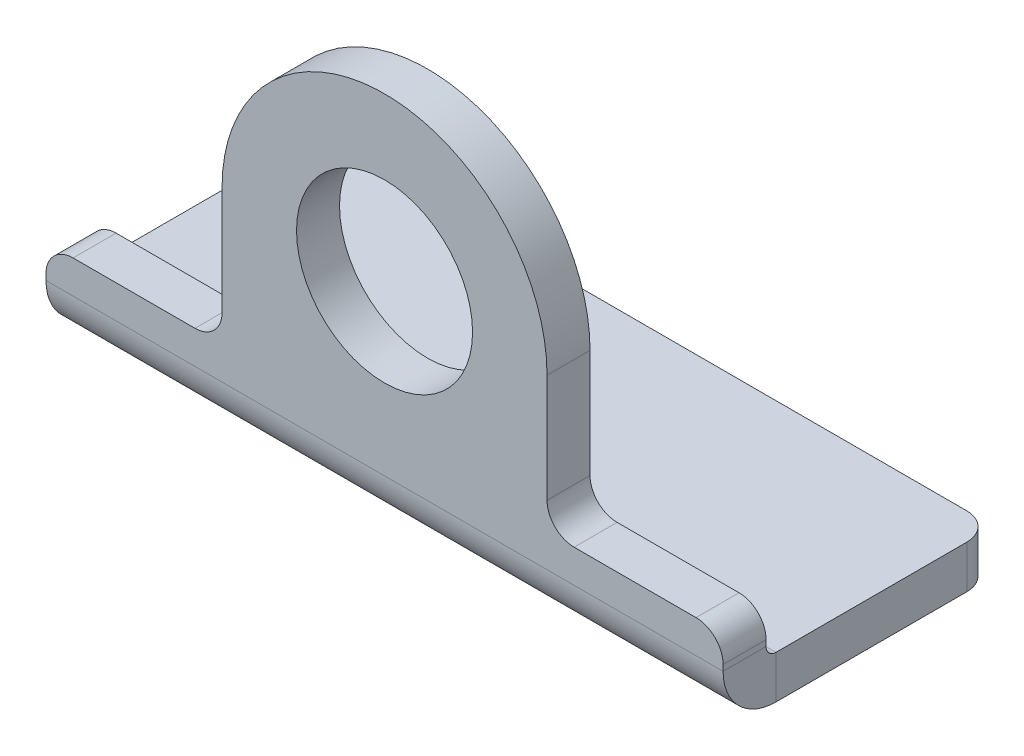
ISO-10303-21;
HEADER;
FILE_DESCRIPTION(('STEP AP214'),'2;1');
FILE_NAME('part.step','',(''),(''),'','','');
FILE_SCHEMA(('AUTOMOTIVE_DESIGN { 1 0 10303 214 1 1 1 1 }'));
ENDSEC;
DATA;
#1=APPLICATION_CONTEXT('core data for automotive mechanical design processes');
#2=APPLICATION_PROTOCOL_DEFINITION('international standard','automotive_design',2000,#1);
#3=PRODUCT_CONTEXT('',#1,'mechanical');
#4=PRODUCT('Part','Part','',(#3));
#5=PRODUCT_RELATED_PRODUCT_CATEGORY('part','',(#4));
#6=PRODUCT_DEFINITION_FORMATION('','',#4);
#7=PRODUCT_DEFINITION_CONTEXT('part definition',#1,'design');
#8=PRODUCT_DEFINITION('design','',#6,#7);
#9=PRODUCT_DEFINITION_SHAPE('','',#8);
#10=(LENGTH_UNIT() NAMED_UNIT(*) SI_UNIT(.MILLI.,.METRE.));
#11=(NAMED_UNIT(*) PLANE_ANGLE_UNIT() SI_UNIT($,.RADIAN.));
#12=(NAMED_UNIT(*) SI_UNIT($,.STERADIAN.) SOLID_ANGLE_UNIT());
#13=UNCERTAINTY_MEASURE_WITH_UNIT(LENGTH_MEASURE(1.E-05),#10,'distance_accuracy_value','');
#14=(GEOMETRIC_REPRESENTATION_CONTEXT(3) GLOBAL_UNCERTAINTY_ASSIGNED_CONTEXT((#13)) GLOBAL_UNIT_ASSIGNED_CONTEXT((#10,
#11,#12)) REPRESENTATION_CONTEXT('',''));
#15=CARTESIAN_POINT('',(0.,0.,0.));
#16=DIRECTION('',(0.,0.,1.));
#17=DIRECTION('',(1.,0.,0.));
#18=AXIS2_PLACEMENT_3D('',#15,#16,#17);
#19=CARTESIAN_POINT('',(-25.,1.17499999999999,-3.175));
#20=DIRECTION('',(-1.,0.,0.));
#21=DIRECTION('',(0.,0.,1.));
#22=AXIS2_PLACEMENT_3D('',#19,#20,#21);
#23=PLANE('',#22);
#24=DIRECTION('',(0.,-1.,0.));
#25=VECTOR('',#24,1.);
#26=CARTESIAN_POINT('',(-25.,1.17499999999999,-3.175));
#27=LINE('',#26,#25);
#28=CARTESIAN_POINT('',(-25.,1.17499999999999,-3.175));
#29=VERTEX_POINT('',#28);
#30=CARTESIAN_POINT('',(-25.,0.736599999999997,-3.175));
#31=VERTEX_POINT('',#30);
#32=EDGE_CURVE('E335',#29,#31,#27,.T.);
#33=ORIENTED_EDGE('',*,*,#32,.T.);
#34=DIRECTION('',(0.,0.,1.));
#35=VECTOR('',#34,1.);
#36=CARTESIAN_POINT('',(-25.,0.736599999999997,-3.175));
#37=LINE('',#36,#35);
#38=CARTESIAN_POINT('',(-25.,0.736599999999993,0.));
#39=VERTEX_POINT('',#38);
#40=EDGE_CURVE('E270',#31,#39,#37,.T.);
#41=ORIENTED_EDGE('',*,*,#40,.T.);
#42=DIRECTION('',(0.,-1.,0.));
#43=VECTOR('',#42,1.);
#44=CARTESIAN_POINT('',(-25.,1.17499999999999,0.));
#45=LINE('',#44,#43);
#46=CARTESIAN_POINT('',(-25.,1.17499999999999,0.));
#47=VERTEX_POINT('',#46);
#48=EDGE_CURVE('E299',#47,#39,#45,.T.);
#49=ORIENTED_EDGE('',*,*,#48,.F.);
#50=DIRECTION('',(0.,0.,1.));
#51=VECTOR('',#50,1.);
#52=CARTESIAN_POINT('',(-25.,1.17499999999999,-3.175));
#53=LINE('',#52,#51);
#54=EDGE_CURVE('E381',#29,#47,#53,.T.);
#55=ORIENTED_EDGE('',*,*,#54,.F.);
#56=EDGE_LOOP('',(#33,#41,#49,#55));
#57=FACE_BOUND('',#56,.T.);
#58=ADVANCED_FACE('F51',(#57),#23,.T.);
#59=CARTESIAN_POINT('',(23.,1.17500000000001,-3.175));
#60=DIRECTION('',(0.,0.,1.));
#61=DIRECTION('',(1.,0.,0.));
#62=AXIS2_PLACEMENT_3D('',#59,#60,#61);
#63=PLANE('',#62);
#64=CARTESIAN_POINT('',(0.,13.175,-3.175));
#65=DIRECTION('',(0.,0.,1.));
#66=DIRECTION('',(1.,0.,0.));
#67=AXIS2_PLACEMENT_3D('',#64,#65,#66);
#68=CIRCLE('',#67,6.5);
#69=CARTESIAN_POINT('',(6.50000000000001,13.175,-3.175));
#70=VERTEX_POINT('',#69);
#71=EDGE_CURVE('E287',#70,#70,#68,.T.);
#72=ORIENTED_EDGE('',*,*,#71,.T.);
#73=EDGE_LOOP('',(#72));
#74=FACE_BOUND('',#73,.T.);
#75=DIRECTION('',(-1.,0.,0.));
#76=VECTOR('',#75,1.);
#77=CARTESIAN_POINT('',(-25.,0.736599999999997,-3.175));
#78=LINE('',#77,#76);
#79=CARTESIAN_POINT('',(25.,0.736600000000005,-3.175));
#80=VERTEX_POINT('',#79);
#81=EDGE_CURVE('E275',#31,#80,#78,.F.);
#82=ORIENTED_EDGE('',*,*,#81,.F.);
#83=ORIENTED_EDGE('',*,*,#32,.F.);
#84=CARTESIAN_POINT('',(-23.,1.175,-3.175));
#85=DIRECTION('',(0.,0.,1.));
#86=DIRECTION('',(1.,0.,0.));
#87=AXIS2_PLACEMENT_3D('',#84,#85,#86);
#88=CIRCLE('',#87,2.);
#89=CARTESIAN_POINT('',(-23.,3.175,-3.175));
#90=VERTEX_POINT('',#89);
#91=EDGE_CURVE('E331',#90,#29,#88,.T.);
#92=ORIENTED_EDGE('',*,*,#91,.F.);
#93=DIRECTION('',(-1.,0.,0.));
#94=VECTOR('',#93,1.);
#95=CARTESIAN_POINT('',(-14.,3.175,-3.175));
#96=LINE('',#95,#94);
#97=CARTESIAN_POINT('',(-14.,3.175,-3.175));
#98=VERTEX_POINT('',#97);
#99=EDGE_CURVE('E327',#98,#90,#96,.T.);
#100=ORIENTED_EDGE('',*,*,#99,.F.);
#101=CARTESIAN_POINT('',(-14.,5.175,-3.175));
#102=DIRECTION('',(0.,0.,-1.));
#103=DIRECTION('',(-1.,0.,0.));
#104=AXIS2_PLACEMENT_3D('',#101,#102,#103);
#105=CIRCLE('',#104,2.);
#106=CARTESIAN_POINT('',(-12.,5.17500000000002,-3.175));
#107=VERTEX_POINT('',#106);
#108=EDGE_CURVE('E323',#107,#98,#105,.T.);
#109=ORIENTED_EDGE('',*,*,#108,.F.);
#110=DIRECTION('',(0.,-1.,0.));
#111=VECTOR('',#110,1.);
#112=CARTESIAN_POINT('',(-12.,13.175,-3.175));
#113=LINE('',#112,#111);
#114=CARTESIAN_POINT('',(-12.,13.175,-3.175));
#115=VERTEX_POINT('',#114);
#116=EDGE_CURVE('E319',#115,#107,#113,.T.);
#117=ORIENTED_EDGE('',*,*,#116,.F.);
#118=CARTESIAN_POINT('',(0.,13.175,-3.175));
#119=DIRECTION('',(0.,0.,1.));
#120=DIRECTION('',(1.,0.,0.));
#121=AXIS2_PLACEMENT_3D('',#118,#119,#120);
#122=CIRCLE('',#121,12.);
#123=CARTESIAN_POINT('',(12.,13.175,-3.175));
#124=VERTEX_POINT('',#123);
#125=EDGE_CURVE('E315',#124,#115,#122,.T.);
#126=ORIENTED_EDGE('',*,*,#125,.F.);
#127=DIRECTION('',(0.,1.,0.));
#128=VECTOR('',#127,1.);
#129=CARTESIAN_POINT('',(12.,5.17500000000002,-3.175));
#130=LINE('',#129,#128);
#131=CARTESIAN_POINT('',(12.,5.17500000000002,-3.175));
#132=VERTEX_POINT('',#131);
#133=EDGE_CURVE('E311',#132,#124,#130,.T.);
#134=ORIENTED_EDGE('',*,*,#133,.F.);
#135=CARTESIAN_POINT('',(14.,5.17500000000001,-3.175));
#136=DIRECTION('',(0.,0.,-1.));
#137=DIRECTION('',(-1.,0.,0.));
#138=AXIS2_PLACEMENT_3D('',#135,#136,#137);
#139=CIRCLE('',#138,2.);
#140=CARTESIAN_POINT('',(14.,3.17500000000001,-3.175));
#141=VERTEX_POINT('',#140);
#142=EDGE_CURVE('E307',#141,#132,#139,.T.);
#143=ORIENTED_EDGE('',*,*,#142,.F.);
#144=DIRECTION('',(-1.,0.,0.));
#145=VECTOR('',#144,1.);
#146=CARTESIAN_POINT('',(23.,3.17500000000001,-3.175));
#147=LINE('',#146,#145);
#148=CARTESIAN_POINT('',(23.,3.17500000000001,-3.175));
#149=VERTEX_POINT('',#148);
#150=EDGE_CURVE('E303',#149,#141,#147,.T.);
#151=ORIENTED_EDGE('',*,*,#150,.F.);
#152=CARTESIAN_POINT('',(23.,1.17500000000001,-3.175));
#153=DIRECTION('',(0.,0.,1.));
#154=DIRECTION('',(1.,0.,0.));
#155=AXIS2_PLACEMENT_3D('',#152,#153,#154);
#156=CIRCLE('',#155,2.);
#157=CARTESIAN_POINT('',(25.,1.17499999999999,-3.175));
#158=VERTEX_POINT('',#157);
#159=EDGE_CURVE('E298',#158,#149,#156,.T.);
#160=ORIENTED_EDGE('',*,*,#159,.F.);
#161=DIRECTION('',(0.,1.,0.));
#162=VECTOR('',#161,1.);
#163=CARTESIAN_POINT('',(25.,0.,-3.175));
#164=LINE('',#163,#162);
#165=EDGE_CURVE('E295',#80,#158,#164,.T.);
#166=ORIENTED_EDGE('',*,*,#165,.F.);
#167=EDGE_LOOP('',(#82,#83,#92,#100,#109,#117,#126,#134,#143,#151,#160,#166));
#168=FACE_BOUND('',#167,.T.);
#169=ADVANCED_FACE('F463',(#74,#168),#63,.F.);
#170=CARTESIAN_POINT('',(23.,1.17500000000001,0.));
#171=DIRECTION('',(0.,0.,1.));
#172=DIRECTION('',(1.,0.,0.));
#173=AXIS2_PLACEMENT_3D('',#170,#171,#172);
#174=PLANE('',#173);
#175=CARTESIAN_POINT('',(0.,13.175,0.));
#176=DIRECTION('',(0.,0.,1.));
#177=DIRECTION('',(1.,0.,0.));
#178=AXIS2_PLACEMENT_3D('',#175,#176,#177);
#179=CIRCLE('',#178,6.5);
#180=CARTESIAN_POINT('',(6.50000000000001,13.175,0.));
#181=VERTEX_POINT('',#180);
#182=EDGE_CURVE('E284',#181,#181,#179,.T.);
#183=ORIENTED_EDGE('',*,*,#182,.F.);
#184=EDGE_LOOP('',(#183));
#185=FACE_BOUND('',#184,.T.);
#186=ORIENTED_EDGE('',*,*,#48,.T.);
#187=DIRECTION('',(-1.,0.,0.));
#188=VECTOR('',#187,1.);
#189=CARTESIAN_POINT('',(-25.,0.736599999999993,0.));
#190=LINE('',#189,#188);
#191=CARTESIAN_POINT('',(25.,0.736600000000005,0.));
#192=VERTEX_POINT('',#191);
#193=EDGE_CURVE('E222',#39,#192,#190,.F.);
#194=ORIENTED_EDGE('',*,*,#193,.T.);
#195=DIRECTION('',(0.,1.,0.));
#196=VECTOR('',#195,1.);
#197=CARTESIAN_POINT('',(25.,0.,0.));
#198=LINE('',#197,#196);
#199=CARTESIAN_POINT('',(25.,1.17499999999999,0.));
#200=VERTEX_POINT('',#199);
#201=EDGE_CURVE('E291',#192,#200,#198,.T.);
#202=ORIENTED_EDGE('',*,*,#201,.T.);
#203=CARTESIAN_POINT('',(23.,1.17500000000001,0.));
#204=DIRECTION('',(0.,0.,1.));
#205=DIRECTION('',(1.,0.,0.));
#206=AXIS2_PLACEMENT_3D('',#203,#204,#205);
#207=CIRCLE('',#206,2.);
#208=CARTESIAN_POINT('',(23.,3.17500000000001,0.));
#209=VERTEX_POINT('',#208);
#210=EDGE_CURVE('E342',#200,#209,#207,.T.);
#211=ORIENTED_EDGE('',*,*,#210,.T.);
#212=DIRECTION('',(-1.,0.,0.));
#213=VECTOR('',#212,1.);
#214=CARTESIAN_POINT('',(23.,3.17500000000001,0.));
#215=LINE('',#214,#213);
#216=CARTESIAN_POINT('',(14.,3.17500000000001,0.));
#217=VERTEX_POINT('',#216);
#218=EDGE_CURVE('E346',#209,#217,#215,.T.);
#219=ORIENTED_EDGE('',*,*,#218,.T.);
#220=CARTESIAN_POINT('',(14.,5.17500000000001,0.));
#221=DIRECTION('',(0.,0.,-1.));
#222=DIRECTION('',(-1.,0.,0.));
#223=AXIS2_PLACEMENT_3D('',#220,#221,#222);
#224=CIRCLE('',#223,2.);
#225=CARTESIAN_POINT('',(12.,5.17500000000002,0.));
#226=VERTEX_POINT('',#225);
#227=EDGE_CURVE('E350',#217,#226,#224,.T.);
#228=ORIENTED_EDGE('',*,*,#227,.T.);
#229=DIRECTION('',(0.,1.,0.));
#230=VECTOR('',#229,1.);
#231=CARTESIAN_POINT('',(12.,5.17500000000002,0.));
#232=LINE('',#231,#230);
#233=CARTESIAN_POINT('',(12.,13.175,0.));
#234=VERTEX_POINT('',#233);
#235=EDGE_CURVE('E354',#226,#234,#232,.T.);
#236=ORIENTED_EDGE('',*,*,#235,.T.);
#237=CARTESIAN_POINT('',(0.,13.175,0.));
#238=DIRECTION('',(0.,0.,1.));
#239=DIRECTION('',(1.,0.,0.));
#240=AXIS2_PLACEMENT_3D('',#237,#238,#239);
#241=CIRCLE('',#240,12.);
#242=CARTESIAN_POINT('',(-12.,13.175,0.));
#243=VERTEX_POINT('',#242);
#244=EDGE_CURVE('E358',#234,#243,#241,.T.);
#245=ORIENTED_EDGE('',*,*,#244,.T.);
#246=DIRECTION('',(0.,-1.,0.));
#247=VECTOR('',#246,1.);
#248=CARTESIAN_POINT('',(-12.,13.175,0.));
#249=LINE('',#248,#247);
#250=CARTESIAN_POINT('',(-12.,5.17500000000002,0.));
#251=VERTEX_POINT('',#250);
#252=EDGE_CURVE('E362',#243,#251,#249,.T.);
#253=ORIENTED_EDGE('',*,*,#252,.T.);
#254=CARTESIAN_POINT('',(-14.,5.175,0.));
#255=DIRECTION('',(0.,0.,-1.));
#256=DIRECTION('',(-1.,0.,0.));
#257=AXIS2_PLACEMENT_3D('',#254,#255,#256);
#258=CIRCLE('',#257,2.);
#259=CARTESIAN_POINT('',(-14.,3.175,0.));
#260=VERTEX_POINT('',#259);
#261=EDGE_CURVE('E366',#251,#260,#258,.T.);
#262=ORIENTED_EDGE('',*,*,#261,.T.);
#263=DIRECTION('',(-1.,0.,0.));
#264=VECTOR('',#263,1.);
#265=CARTESIAN_POINT('',(-14.,3.175,0.));
#266=LINE('',#265,#264);
#267=CARTESIAN_POINT('',(-23.,3.175,0.));
#268=VERTEX_POINT('',#267);
#269=EDGE_CURVE('E370',#260,#268,#266,.T.);
#270=ORIENTED_EDGE('',*,*,#269,.T.);
#271=CARTESIAN_POINT('',(-23.,1.175,0.));
#272=DIRECTION('',(0.,0.,1.));
#273=DIRECTION('',(1.,0.,0.));
#274=AXIS2_PLACEMENT_3D('',#271,#272,#273);
#275=CIRCLE('',#274,2.);
#276=EDGE_CURVE('E374',#268,#47,#275,.T.);
#277=ORIENTED_EDGE('',*,*,#276,.T.);
#278=EDGE_LOOP('',(#186,#194,#202,#211,#219,#228,#236,#245,#253,#262,#270,#277));
#279=FACE_BOUND('',#278,.T.);
#280=ADVANCED_FACE('F472',(#185,#279),#174,.T.);
#281=CARTESIAN_POINT('',(25.,0.,-3.175));
#282=DIRECTION('',(1.,0.,0.));
#283=DIRECTION('',(0.,0.,-1.));
#284=AXIS2_PLACEMENT_3D('',#281,#282,#283);
#285=PLANE('',#284);
#286=DIRECTION('',(0.,0.,1.));
#287=VECTOR('',#286,1.);
#288=CARTESIAN_POINT('',(25.,0.736600000000005,-3.175));
#289=LINE('',#288,#287);
#290=EDGE_CURVE('E280',#80,#192,#289,.T.);
#291=ORIENTED_EDGE('',*,*,#290,.F.);
#292=ORIENTED_EDGE('',*,*,#165,.T.);
#293=DIRECTION('',(0.,0.,1.));
#294=VECTOR('',#293,1.);
#295=CARTESIAN_POINT('',(25.,1.17499999999999,-3.175));
#296=LINE('',#295,#294);
#297=EDGE_CURVE('E339',#158,#200,#296,.T.);
#298=ORIENTED_EDGE('',*,*,#297,.T.);
#299=ORIENTED_EDGE('',*,*,#201,.F.);
#300=EDGE_LOOP('',(#291,#292,#298,#299));
#301=FACE_BOUND('',#300,.T.);
#302=ADVANCED_FACE('F459',(#301),#285,.T.);
#303=CARTESIAN_POINT('',(-23.,1.175,-3.175));
#304=DIRECTION('',(0.,0.,1.));
#305=DIRECTION('',(1.,0.,0.));
#306=AXIS2_PLACEMENT_3D('',#303,#304,#305);
#307=CYLINDRICAL_SURFACE('',#306,2.);
#308=ORIENTED_EDGE('',*,*,#276,.F.);
#309=DIRECTION('',(0.,0.,1.));
#310=VECTOR('',#309,1.);
#311=CARTESIAN_POINT('',(-23.,3.175,-3.175));
#312=LINE('',#311,#310);
#313=EDGE_CURVE('E385',#90,#268,#312,.T.);
#314=ORIENTED_EDGE('',*,*,#313,.F.);
#315=ORIENTED_EDGE('',*,*,#91,.T.);
#316=ORIENTED_EDGE('',*,*,#54,.T.);
#317=EDGE_LOOP('',(#308,#314,#315,#316));
#318=FACE_BOUND('',#317,.T.);
#319=ADVANCED_FACE('F479',(#318),#307,.T.);
#320=CARTESIAN_POINT('',(-14.,3.175,-3.175));
#321=DIRECTION('',(0.,1.,0.));
#322=DIRECTION('',(-1.,0.,0.));
#323=AXIS2_PLACEMENT_3D('',#320,#321,#322);
#324=PLANE('',#323);
#325=ORIENTED_EDGE('',*,*,#269,.F.);
#326=DIRECTION('',(0.,0.,1.));
#327=VECTOR('',#326,1.);
#328=CARTESIAN_POINT('',(-14.,3.175,-3.175));
#329=LINE('',#328,#327);
#330=EDGE_CURVE('E388',#98,#260,#329,.T.);
#331=ORIENTED_EDGE('',*,*,#330,.F.);
#332=ORIENTED_EDGE('',*,*,#99,.T.);
#333=ORIENTED_EDGE('',*,*,#313,.T.);
#334=EDGE_LOOP('',(#325,#331,#332,#333));
#335=FACE_BOUND('',#334,.T.);
#336=ADVANCED_FACE('F482',(#335),#324,.T.);
#337=CARTESIAN_POINT('',(-14.,5.175,-3.175));
#338=DIRECTION('',(0.,0.,1.));
#339=DIRECTION('',(1.,0.,0.));
#340=AXIS2_PLACEMENT_3D('',#337,#338,#339);
#341=CYLINDRICAL_SURFACE('',#340,2.);
#342=ORIENTED_EDGE('',*,*,#261,.F.);
#343=DIRECTION('',(0.,0.,1.));
#344=VECTOR('',#343,1.);
#345=CARTESIAN_POINT('',(-12.,5.17500000000002,-3.175));
#346=LINE('',#345,#344);
#347=EDGE_CURVE('E391',#107,#251,#346,.T.);
#348=ORIENTED_EDGE('',*,*,#347,.F.);
#349=ORIENTED_EDGE('',*,*,#108,.T.);
#350=ORIENTED_EDGE('',*,*,#330,.T.);
#351=EDGE_LOOP('',(#342,#348,#349,#350));
#352=FACE_BOUND('',#351,.T.);
#353=ADVANCED_FACE('F487',(#352),#341,.F.);
#354=CARTESIAN_POINT('',(-12.,13.175,-3.175));
#355=DIRECTION('',(-1.,0.,0.));
#356=DIRECTION('',(0.,-1.,0.));
#357=AXIS2_PLACEMENT_3D('',#354,#355,#356);
#358=PLANE('',#357);
#359=ORIENTED_EDGE('',*,*,#252,.F.);
#360=DIRECTION('',(0.,0.,1.));
#361=VECTOR('',#360,1.);
#362=CARTESIAN_POINT('',(-12.,13.175,-3.175));
#363=LINE('',#362,#361);
#364=EDGE_CURVE('E394',#115,#243,#363,.T.);
#365=ORIENTED_EDGE('',*,*,#364,.F.);
#366=ORIENTED_EDGE('',*,*,#116,.T.);
#367=ORIENTED_EDGE('',*,*,#347,.T.);
#368=EDGE_LOOP('',(#359,#365,#366,#367));
#369=FACE_BOUND('',#368,.T.);
#370=ADVANCED_FACE('F490',(#369),#358,.T.);
#371=CARTESIAN_POINT('',(0.,13.175,-3.175));
#372=DIRECTION('',(0.,0.,1.));
#373=DIRECTION('',(1.,0.,0.));
#374=AXIS2_PLACEMENT_3D('',#371,#372,#373);
#375=CYLINDRICAL_SURFACE('',#374,12.);
#376=ORIENTED_EDGE('',*,*,#244,.F.);
#377=DIRECTION('',(0.,0.,1.));
#378=VECTOR('',#377,1.);
#379=CARTESIAN_POINT('',(12.,13.175,-3.175));
#380=LINE('',#379,#378);
#381=EDGE_CURVE('E397',#124,#234,#380,.T.);
#382=ORIENTED_EDGE('',*,*,#381,.F.);
#383=ORIENTED_EDGE('',*,*,#125,.T.);
#384=ORIENTED_EDGE('',*,*,#364,.T.);
#385=EDGE_LOOP('',(#376,#382,#383,#384));
#386=FACE_BOUND('',#385,.T.);
#387=ADVANCED_FACE('F495',(#386),#375,.T.);
#388=CARTESIAN_POINT('',(12.,5.17500000000002,-3.175));
#389=DIRECTION('',(1.,0.,0.));
#390=DIRECTION('',(0.,1.,0.));
#391=AXIS2_PLACEMENT_3D('',#388,#389,#390);
#392=PLANE('',#391);
#393=ORIENTED_EDGE('',*,*,#235,.F.);
#394=DIRECTION('',(0.,0.,1.));
#395=VECTOR('',#394,1.);
#396=CARTESIAN_POINT('',(12.,5.17500000000002,-3.175));
#397=LINE('',#396,#395);
#398=EDGE_CURVE('E400',#132,#226,#397,.T.);
#399=ORIENTED_EDGE('',*,*,#398,.F.);
#400=ORIENTED_EDGE('',*,*,#133,.T.);
#401=ORIENTED_EDGE('',*,*,#381,.T.);
#402=EDGE_LOOP('',(#393,#399,#400,#401));
#403=FACE_BOUND('',#402,.T.);
#404=ADVANCED_FACE('F498',(#403),#392,.T.);
#405=CARTESIAN_POINT('',(14.,5.17500000000001,-3.175));
#406=DIRECTION('',(0.,0.,1.));
#407=DIRECTION('',(1.,0.,0.));
#408=AXIS2_PLACEMENT_3D('',#405,#406,#407);
#409=CYLINDRICAL_SURFACE('',#408,2.);
#410=ORIENTED_EDGE('',*,*,#227,.F.);
#411=DIRECTION('',(0.,0.,1.));
#412=VECTOR('',#411,1.);
#413=CARTESIAN_POINT('',(14.,3.17500000000001,-3.175));
#414=LINE('',#413,#412);
#415=EDGE_CURVE('E403',#141,#217,#414,.T.);
#416=ORIENTED_EDGE('',*,*,#415,.F.);
#417=ORIENTED_EDGE('',*,*,#142,.T.);
#418=ORIENTED_EDGE('',*,*,#398,.T.);
#419=EDGE_LOOP('',(#410,#416,#417,#418));
#420=FACE_BOUND('',#419,.T.);
#421=ADVANCED_FACE('F501',(#420),#409,.F.);
#422=CARTESIAN_POINT('',(23.,3.17500000000001,-3.175));
#423=DIRECTION('',(0.,1.,0.));
#424=DIRECTION('',(-1.,0.,0.));
#425=AXIS2_PLACEMENT_3D('',#422,#423,#424);
#426=PLANE('',#425);
#427=ORIENTED_EDGE('',*,*,#218,.F.);
#428=DIRECTION('',(0.,0.,1.));
#429=VECTOR('',#428,1.);
#430=CARTESIAN_POINT('',(23.,3.17500000000001,-3.175));
#431=LINE('',#430,#429);
#432=EDGE_CURVE('E406',#149,#209,#431,.T.);
#433=ORIENTED_EDGE('',*,*,#432,.F.);
#434=ORIENTED_EDGE('',*,*,#150,.T.);
#435=ORIENTED_EDGE('',*,*,#415,.T.);
#436=EDGE_LOOP('',(#427,#433,#434,#435));
#437=FACE_BOUND('',#436,.T.);
#438=ADVANCED_FACE('F503',(#437),#426,.T.);
#439=CARTESIAN_POINT('',(23.,1.17500000000001,-3.175));
#440=DIRECTION('',(0.,0.,1.));
#441=DIRECTION('',(1.,0.,0.));
#442=AXIS2_PLACEMENT_3D('',#439,#440,#441);
#443=CYLINDRICAL_SURFACE('',#442,2.);
#444=ORIENTED_EDGE('',*,*,#210,.F.);
#445=ORIENTED_EDGE('',*,*,#297,.F.);
#446=ORIENTED_EDGE('',*,*,#159,.T.);
#447=ORIENTED_EDGE('',*,*,#432,.T.);
#448=EDGE_LOOP('',(#444,#445,#446,#447));
#449=FACE_BOUND('',#448,.T.);
#450=ADVANCED_FACE('F469',(#449),#443,.T.);
#451=CARTESIAN_POINT('',(0.,13.175,-3.175));
#452=DIRECTION('',(0.,0.,1.));
#453=DIRECTION('',(1.,0.,0.));
#454=AXIS2_PLACEMENT_3D('',#451,#452,#453);
#455=CYLINDRICAL_SURFACE('',#454,6.5);
#456=ORIENTED_EDGE('',*,*,#71,.F.);
#457=EDGE_LOOP('',(#456));
#458=FACE_BOUND('',#457,.T.);
#459=ORIENTED_EDGE('',*,*,#182,.T.);
#460=EDGE_LOOP('',(#459));
#461=FACE_BOUND('',#460,.T.);
#462=ADVANCED_FACE('F510',(#458,#461),#455,.F.);
#463=CARTESIAN_POINT('',(25.,0.736600000000005,-3.9116));
#464=DIRECTION('',(1.,0.,0.));
#465=DIRECTION('',(0.,1.,0.));
#466=AXIS2_PLACEMENT_3D('',#463,#464,#465);
#467=PLANE('',#466);
#468=DIRECTION('',(0.,-1.,0.));
#469=VECTOR('',#468,1.);
#470=CARTESIAN_POINT('',(25.,0.,-3.9116));
#471=LINE('',#470,#469);
#472=CARTESIAN_POINT('',(25.,0.,-3.9116));
#473=VERTEX_POINT('',#472);
#474=CARTESIAN_POINT('',(25.,-3.17499999999999,-3.91159999999999));
#475=VERTEX_POINT('',#474);
#476=EDGE_CURVE('E437',#473,#475,#471,.T.);
#477=ORIENTED_EDGE('',*,*,#476,.F.);
#478=CARTESIAN_POINT('',(25.,0.736600000000005,-3.9116));
#479=DIRECTION('',(-1.,0.,0.));
#480=DIRECTION('',(0.,-1.,0.));
#481=AXIS2_PLACEMENT_3D('',#478,#479,#480);
#482=CIRCLE('',#481,0.736599999999999);
#483=EDGE_CURVE('E226',#80,#473,#482,.F.);
#484=ORIENTED_EDGE('',*,*,#483,.F.);
#485=ORIENTED_EDGE('',*,*,#290,.T.);
#486=CARTESIAN_POINT('',(25.,0.736600000000005,-3.9116));
#487=DIRECTION('',(-1.,0.,0.));
#488=DIRECTION('',(0.,-1.,0.));
#489=AXIS2_PLACEMENT_3D('',#486,#487,#488);
#490=CIRCLE('',#489,3.9116);
#491=EDGE_CURVE('E268',#192,#475,#490,.F.);
#492=ORIENTED_EDGE('',*,*,#491,.T.);
#493=EDGE_LOOP('',(#477,#484,#485,#492));
#494=FACE_BOUND('',#493,.T.);
#495=ADVANCED_FACE('F455',(#494),#467,.T.);
#496=CARTESIAN_POINT('',(-25.,0.736599999999998,-3.9116));
#497=DIRECTION('',(1.,0.,0.));
#498=DIRECTION('',(0.,1.,0.));
#499=AXIS2_PLACEMENT_3D('',#496,#497,#498);
#500=PLANE('',#499);
#501=CARTESIAN_POINT('',(-25.,0.736599999999998,-3.9116));
#502=DIRECTION('',(-1.,0.,0.));
#503=DIRECTION('',(0.,-1.,0.));
#504=AXIS2_PLACEMENT_3D('',#501,#502,#503);
#505=CIRCLE('',#504,0.736599999999999);
#506=CARTESIAN_POINT('',(-25.,0.,-3.9116));
#507=VERTEX_POINT('',#506);
#508=EDGE_CURVE('E233',#507,#31,#505,.T.);
#509=ORIENTED_EDGE('',*,*,#508,.F.);
#510=DIRECTION('',(0.,-1.,0.));
#511=VECTOR('',#510,1.);
#512=CARTESIAN_POINT('',(-25.,0.,-3.9116));
#513=LINE('',#512,#511);
#514=CARTESIAN_POINT('',(-25.,-3.175,-3.91159999999999));
#515=VERTEX_POINT('',#514);
#516=EDGE_CURVE('E230',#507,#515,#513,.T.);
#517=ORIENTED_EDGE('',*,*,#516,.T.);
#518=CARTESIAN_POINT('',(-25.,0.736599999999998,-3.9116));
#519=DIRECTION('',(-1.,0.,0.));
#520=DIRECTION('',(0.,-1.,0.));
#521=AXIS2_PLACEMENT_3D('',#518,#519,#520);
#522=CIRCLE('',#521,3.9116);
#523=EDGE_CURVE('E215',#515,#39,#522,.T.);
#524=ORIENTED_EDGE('',*,*,#523,.T.);
#525=ORIENTED_EDGE('',*,*,#40,.F.);
#526=EDGE_LOOP('',(#509,#517,#524,#525));
#527=FACE_BOUND('',#526,.T.);
#528=ADVANCED_FACE('F231',(#527),#500,.F.);
#529=CARTESIAN_POINT('',(-25.,0.736599999999998,-3.9116));
#530=DIRECTION('',(-1.,0.,0.));
#531=DIRECTION('',(0.,-1.,0.));
#532=AXIS2_PLACEMENT_3D('',#529,#530,#531);
#533=CYLINDRICAL_SURFACE('',#532,3.9116);
#534=ORIENTED_EDGE('',*,*,#193,.F.);
#535=ORIENTED_EDGE('',*,*,#523,.F.);
#536=DIRECTION('',(1.,0.,0.));
#537=VECTOR('',#536,1.);
#538=CARTESIAN_POINT('',(0.,-3.175,-3.91159999999999));
#539=LINE('',#538,#537);
#540=EDGE_CURVE('E219',#515,#475,#539,.T.);
#541=ORIENTED_EDGE('',*,*,#540,.T.);
#542=ORIENTED_EDGE('',*,*,#491,.F.);
#543=EDGE_LOOP('',(#534,#535,#541,#542));
#544=FACE_BOUND('',#543,.T.);
#545=ADVANCED_FACE('F217',(#544),#533,.T.);
#546=CARTESIAN_POINT('',(-25.,0.736599999999998,-3.9116));
#547=DIRECTION('',(-1.,0.,0.));
#548=DIRECTION('',(0.,-1.,0.));
#549=AXIS2_PLACEMENT_3D('',#546,#547,#548);
#550=CYLINDRICAL_SURFACE('',#549,0.736599999999999);
#551=ORIENTED_EDGE('',*,*,#81,.T.);
#552=ORIENTED_EDGE('',*,*,#483,.T.);
#553=DIRECTION('',(-1.,0.,0.));
#554=VECTOR('',#553,1.);
#555=CARTESIAN_POINT('',(25.,0.,-3.9116));
#556=LINE('',#555,#554);
#557=EDGE_CURVE('E236',#473,#507,#556,.T.);
#558=ORIENTED_EDGE('',*,*,#557,.T.);
#559=ORIENTED_EDGE('',*,*,#508,.T.);
#560=EDGE_LOOP('',(#551,#552,#558,#559));
#561=FACE_BOUND('',#560,.T.);
#562=ADVANCED_FACE('F450',(#561),#550,.F.);
#563=CARTESIAN_POINT('',(-25.,-3.17500000000006,-20.));
#564=DIRECTION('',(1.,0.,0.));
#565=DIRECTION('',(0.,1.,0.));
#566=AXIS2_PLACEMENT_3D('',#563,#564,#565);
#567=PLANE('',#566);
#568=DIRECTION('',(0.,0.,-1.));
#569=VECTOR('',#568,1.);
#570=CARTESIAN_POINT('',(-25.,0.,-20.));
#571=LINE('',#570,#569);
#572=CARTESIAN_POINT('',(-25.,0.,-18.));
#573=VERTEX_POINT('',#572);
#574=EDGE_CURVE('E245',#507,#573,#571,.T.);
#575=ORIENTED_EDGE('',*,*,#574,.T.);
#576=DIRECTION('',(0.,1.,0.));
#577=VECTOR('',#576,1.);
#578=CARTESIAN_POINT('',(-25.,-3.17500000000005,-18.));
#579=LINE('',#578,#577);
#580=CARTESIAN_POINT('',(-25.,-3.17500000000005,-18.));
#581=VERTEX_POINT('',#580);
#582=EDGE_CURVE('E11',#573,#581,#579,.F.);
#583=ORIENTED_EDGE('',*,*,#582,.T.);
#584=DIRECTION('',(0.,0.,-1.));
#585=VECTOR('',#584,1.);
#586=CARTESIAN_POINT('',(-25.,-3.17500000000006,-20.));
#587=LINE('',#586,#585);
#588=EDGE_CURVE('E240',#515,#581,#587,.T.);
#589=ORIENTED_EDGE('',*,*,#588,.F.);
#590=ORIENTED_EDGE('',*,*,#516,.F.);
#591=EDGE_LOOP('',(#575,#583,#589,#590));
#592=FACE_BOUND('',#591,.T.);
#593=ADVANCED_FACE('F247',(#592),#567,.F.);
#594=CARTESIAN_POINT('',(25.,-3.17499999999999,-3.17499999999999));
#595=DIRECTION('',(-1.,0.,0.));
#596=DIRECTION('',(0.,-1.,0.));
#597=AXIS2_PLACEMENT_3D('',#594,#595,#596);
#598=PLANE('',#597);
#599=DIRECTION('',(0.,0.,1.));
#600=VECTOR('',#599,1.);
#601=CARTESIAN_POINT('',(25.,-3.17499999999999,-3.17499999999999));
#602=LINE('',#601,#600);
#603=CARTESIAN_POINT('',(25.,-3.17500000000004,-18.));
#604=VERTEX_POINT('',#603);
#605=EDGE_CURVE('E243',#604,#475,#602,.T.);
#606=ORIENTED_EDGE('',*,*,#605,.F.);
#607=DIRECTION('',(0.,1.,0.));
#608=VECTOR('',#607,1.);
#609=CARTESIAN_POINT('',(25.,-3.17500000000004,-18.));
#610=LINE('',#609,#608);
#611=CARTESIAN_POINT('',(25.,0.,-18.));
#612=VERTEX_POINT('',#611);
#613=EDGE_CURVE('E384',#604,#612,#610,.T.);
#614=ORIENTED_EDGE('',*,*,#613,.T.);
#615=DIRECTION('',(0.,0.,1.));
#616=VECTOR('',#615,1.);
#617=CARTESIAN_POINT('',(25.,0.,-3.175));
#618=LINE('',#617,#616);
#619=EDGE_CURVE('E250',#612,#473,#618,.T.);
#620=ORIENTED_EDGE('',*,*,#619,.T.);
#621=ORIENTED_EDGE('',*,*,#476,.T.);
#622=EDGE_LOOP('',(#606,#614,#620,#621));
#623=FACE_BOUND('',#622,.T.);
#624=ADVANCED_FACE('F434',(#623),#598,.F.);
#625=CARTESIAN_POINT('',(0.,-3.17499999999998,0.));
#626=DIRECTION('',(0.,1.,0.));
#627=DIRECTION('',(0.,0.,1.));
#628=AXIS2_PLACEMENT_3D('',#625,#626,#627);
#629=PLANE('',#628);
#630=DIRECTION('',(1.,0.,0.));
#631=VECTOR('',#630,1.);
#632=CARTESIAN_POINT('',(25.,-3.17500000000005,-20.));
#633=LINE('',#632,#631);
#634=CARTESIAN_POINT('',(-23.,-3.17500000000006,-20.));
#635=VERTEX_POINT('',#634);
#636=CARTESIAN_POINT('',(23.,-3.17500000000005,-20.));
#637=VERTEX_POINT('',#636);
#638=EDGE_CURVE('E249',#635,#637,#633,.T.);
#639=ORIENTED_EDGE('',*,*,#638,.T.);
#640=CARTESIAN_POINT('',(23.,-3.17500000000004,-18.));
#641=DIRECTION('',(0.,1.,0.));
#642=DIRECTION('',(0.,0.,1.));
#643=AXIS2_PLACEMENT_3D('',#640,#641,#642);
#644=CIRCLE('',#643,2.);
#645=EDGE_CURVE('E60',#637,#604,#644,.F.);
#646=ORIENTED_EDGE('',*,*,#645,.T.);
#647=ORIENTED_EDGE('',*,*,#605,.T.);
#648=ORIENTED_EDGE('',*,*,#540,.F.);
#649=ORIENTED_EDGE('',*,*,#588,.T.);
#650=CARTESIAN_POINT('',(-23.,-3.17500000000005,-18.));
#651=DIRECTION('',(0.,1.,0.));
#652=DIRECTION('',(0.,0.,1.));
#653=AXIS2_PLACEMENT_3D('',#650,#651,#652);
#654=CIRCLE('',#653,2.);
#655=EDGE_CURVE('E427',#581,#635,#654,.F.);
#656=ORIENTED_EDGE('',*,*,#655,.T.);
#657=EDGE_LOOP('',(#639,#646,#647,#648,#649,#656));
#658=FACE_BOUND('',#657,.T.);
#659=ADVANCED_FACE('F239',(#658),#629,.F.);
#660=CARTESIAN_POINT('',(0.,0.,0.));
#661=DIRECTION('',(0.,1.,0.));
#662=DIRECTION('',(0.,0.,1.));
#663=AXIS2_PLACEMENT_3D('',#660,#661,#662);
#664=PLANE('',#663);
#665=ORIENTED_EDGE('',*,*,#619,.F.);
#666=CARTESIAN_POINT('',(23.,0.,-18.));
#667=DIRECTION('',(0.,1.,0.));
#668=DIRECTION('',(0.,0.,1.));
#669=AXIS2_PLACEMENT_3D('',#666,#667,#668);
#670=CIRCLE('',#669,2.);
#671=CARTESIAN_POINT('',(23.,0.,-20.));
#672=VERTEX_POINT('',#671);
#673=EDGE_CURVE('E418',#612,#672,#670,.T.);
#674=ORIENTED_EDGE('',*,*,#673,.T.);
#675=DIRECTION('',(1.,0.,0.));
#676=VECTOR('',#675,1.);
#677=CARTESIAN_POINT('',(25.,0.,-20.));
#678=LINE('',#677,#676);
#679=CARTESIAN_POINT('',(-23.,0.,-20.));
#680=VERTEX_POINT('',#679);
#681=EDGE_CURVE('E256',#680,#672,#678,.T.);
#682=ORIENTED_EDGE('',*,*,#681,.F.);
#683=CARTESIAN_POINT('',(-23.,0.,-18.));
#684=DIRECTION('',(0.,1.,0.));
#685=DIRECTION('',(0.,0.,1.));
#686=AXIS2_PLACEMENT_3D('',#683,#684,#685);
#687=CIRCLE('',#686,2.);
#688=EDGE_CURVE('E415',#680,#573,#687,.T.);
#689=ORIENTED_EDGE('',*,*,#688,.T.);
#690=ORIENTED_EDGE('',*,*,#574,.F.);
#691=ORIENTED_EDGE('',*,*,#557,.F.);
#692=EDGE_LOOP('',(#665,#674,#682,#689,#690,#691));
#693=FACE_BOUND('',#692,.T.);
#694=ADVANCED_FACE('F441',(#693),#664,.T.);
#695=CARTESIAN_POINT('',(25.,-3.17500000000005,-20.));
#696=DIRECTION('',(0.,0.,1.));
#697=DIRECTION('',(0.,-1.,0.));
#698=AXIS2_PLACEMENT_3D('',#695,#696,#697);
#699=PLANE('',#698);
#700=ORIENTED_EDGE('',*,*,#681,.T.);
#701=DIRECTION('',(0.,1.,0.));
#702=VECTOR('',#701,1.);
#703=CARTESIAN_POINT('',(23.,-3.17500000000005,-20.));
#704=LINE('',#703,#702);
#705=EDGE_CURVE('E79',#672,#637,#704,.F.);
#706=ORIENTED_EDGE('',*,*,#705,.T.);
#707=ORIENTED_EDGE('',*,*,#638,.F.);
#708=DIRECTION('',(0.,1.,0.));
#709=VECTOR('',#708,1.);
#710=CARTESIAN_POINT('',(-23.,-3.17500000000006,-20.));
#711=LINE('',#710,#709);
#712=EDGE_CURVE('E421',#635,#680,#711,.T.);
#713=ORIENTED_EDGE('',*,*,#712,.T.);
#714=EDGE_LOOP('',(#700,#706,#707,#713));
#715=FACE_BOUND('',#714,.T.);
#716=ADVANCED_FACE('F443',(#715),#699,.F.);
#717=CARTESIAN_POINT('',(23.,-3.17500000000004,-18.));
#718=DIRECTION('',(0.,1.,0.));
#719=DIRECTION('',(0.,0.,1.));
#720=AXIS2_PLACEMENT_3D('',#717,#718,#719);
#721=CYLINDRICAL_SURFACE('',#720,2.);
#722=ORIENTED_EDGE('',*,*,#645,.F.);
#723=ORIENTED_EDGE('',*,*,#705,.F.);
#724=ORIENTED_EDGE('',*,*,#673,.F.);
#725=ORIENTED_EDGE('',*,*,#613,.F.);
#726=EDGE_LOOP('',(#722,#723,#724,#725));
#727=FACE_BOUND('',#726,.T.);
#728=ADVANCED_FACE('F438',(#727),#721,.T.);
#729=CARTESIAN_POINT('',(-23.,-3.17500000000005,-18.));
#730=DIRECTION('',(0.,1.,0.));
#731=DIRECTION('',(0.,0.,1.));
#732=AXIS2_PLACEMENT_3D('',#729,#730,#731);
#733=CYLINDRICAL_SURFACE('',#732,2.);
#734=ORIENTED_EDGE('',*,*,#655,.F.);
#735=ORIENTED_EDGE('',*,*,#582,.F.);
#736=ORIENTED_EDGE('',*,*,#688,.F.);
#737=ORIENTED_EDGE('',*,*,#712,.F.);
#738=EDGE_LOOP('',(#734,#735,#736,#737));
#739=FACE_BOUND('',#738,.T.);
#740=ADVANCED_FACE('F53',(#739),#733,.T.);
#741=CLOSED_SHELL('',(#58,#169,#280,#302,#319,#336,#353,#370,#387,#404,#421,#438,#450,#462,#495,
#528,#545,#562,#593,#624,#659,#694,#716,#728,#740));
#742=MANIFOLD_SOLID_BREP('B2',#741);
#743=ADVANCED_BREP_SHAPE_REPRESENTATION('',(#18,#742),#14);
#744=SHAPE_DEFINITION_REPRESENTATION(#9,#743);
ENDSEC;
END-ISO-10303-21;
